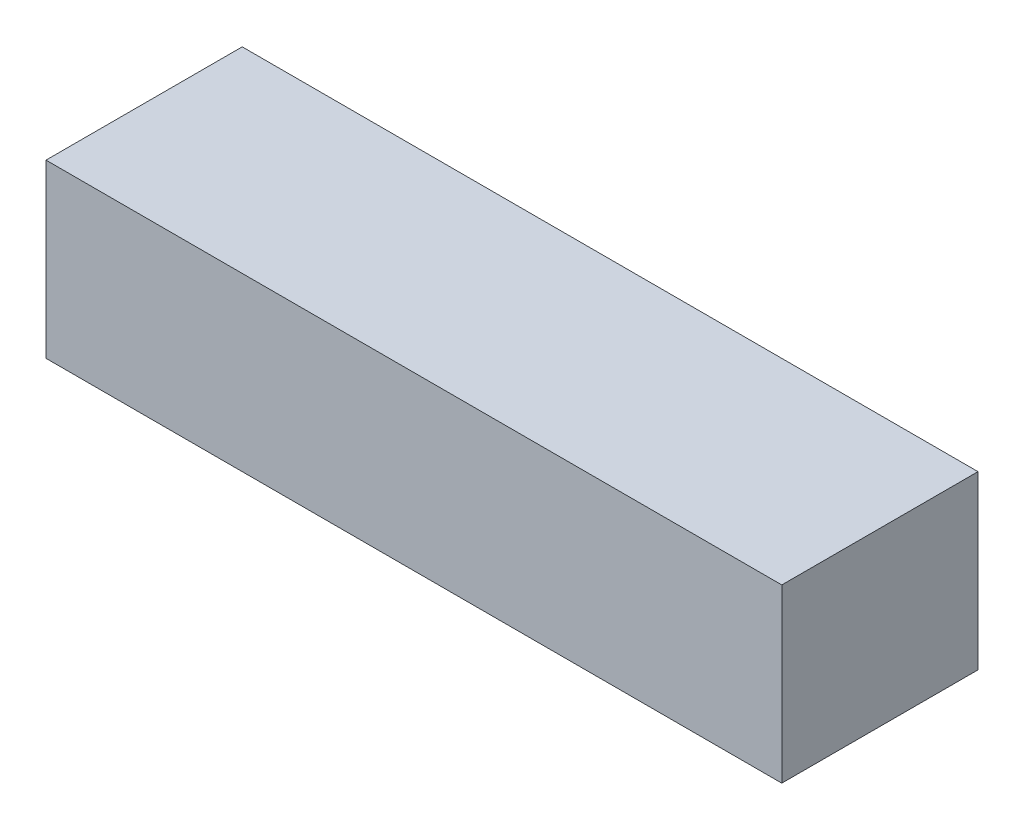
ISO-10303-21;
HEADER;
FILE_DESCRIPTION(('STEP AP214'),'2;1');
FILE_NAME('part.step','',(''),(''),'','','');
FILE_SCHEMA(('AUTOMOTIVE_DESIGN { 1 0 10303 214 1 1 1 1 }'));
ENDSEC;
DATA;
#1=APPLICATION_CONTEXT('core data for automotive mechanical design processes');
#2=APPLICATION_PROTOCOL_DEFINITION('international standard','automotive_design',2000,#1);
#3=PRODUCT_CONTEXT('',#1,'mechanical');
#4=PRODUCT('Part','Part','',(#3));
#5=PRODUCT_RELATED_PRODUCT_CATEGORY('part','',(#4));
#6=PRODUCT_DEFINITION_FORMATION('','',#4);
#7=PRODUCT_DEFINITION_CONTEXT('part definition',#1,'design');
#8=PRODUCT_DEFINITION('design','',#6,#7);
#9=PRODUCT_DEFINITION_SHAPE('','',#8);
#10=(LENGTH_UNIT() NAMED_UNIT(*) SI_UNIT(.MILLI.,.METRE.));
#11=(NAMED_UNIT(*) PLANE_ANGLE_UNIT() SI_UNIT($,.RADIAN.));
#12=(NAMED_UNIT(*) SI_UNIT($,.STERADIAN.) SOLID_ANGLE_UNIT());
#13=UNCERTAINTY_MEASURE_WITH_UNIT(LENGTH_MEASURE(1.E-05),#10,'distance_accuracy_value','');
#14=(GEOMETRIC_REPRESENTATION_CONTEXT(3) GLOBAL_UNCERTAINTY_ASSIGNED_CONTEXT((#13)) GLOBAL_UNIT_ASSIGNED_CONTEXT((#10,
#11,#12)) REPRESENTATION_CONTEXT('',''));
#15=CARTESIAN_POINT('',(0.,0.,0.));
#16=DIRECTION('',(0.,0.,1.));
#17=DIRECTION('',(1.,0.,0.));
#18=AXIS2_PLACEMENT_3D('',#15,#16,#17);
#19=CARTESIAN_POINT('',(75.,35.,-20.));
#20=DIRECTION('',(-1.,0.,0.));
#21=DIRECTION('',(0.,0.,1.));
#22=AXIS2_PLACEMENT_3D('',#19,#20,#21);
#23=PLANE('',#22);
#24=DIRECTION('',(0.,0.,-1.));
#25=VECTOR('',#24,1.);
#26=CARTESIAN_POINT('',(75.,0.,-20.));
#27=LINE('',#26,#25);
#28=CARTESIAN_POINT('',(75.,0.,20.));
#29=VERTEX_POINT('',#28);
#30=CARTESIAN_POINT('',(75.,0.,-20.));
#31=VERTEX_POINT('',#30);
#32=EDGE_CURVE('E113',#29,#31,#27,.T.);
#33=ORIENTED_EDGE('',*,*,#32,.T.);
#34=DIRECTION('',(0.,-1.,0.));
#35=VECTOR('',#34,1.);
#36=CARTESIAN_POINT('',(75.,35.,-20.));
#37=LINE('',#36,#35);
#38=CARTESIAN_POINT('',(75.,35.,-20.));
#39=VERTEX_POINT('',#38);
#40=EDGE_CURVE('E11',#39,#31,#37,.T.);
#41=ORIENTED_EDGE('',*,*,#40,.F.);
#42=DIRECTION('',(0.,0.,-1.));
#43=VECTOR('',#42,1.);
#44=CARTESIAN_POINT('',(75.,35.,-20.));
#45=LINE('',#44,#43);
#46=CARTESIAN_POINT('',(75.,35.,20.));
#47=VERTEX_POINT('',#46);
#48=EDGE_CURVE('E97',#47,#39,#45,.T.);
#49=ORIENTED_EDGE('',*,*,#48,.F.);
#50=DIRECTION('',(0.,-1.,0.));
#51=VECTOR('',#50,1.);
#52=CARTESIAN_POINT('',(75.,35.,20.));
#53=LINE('',#52,#51);
#54=EDGE_CURVE('E109',#47,#29,#53,.T.);
#55=ORIENTED_EDGE('',*,*,#54,.T.);
#56=EDGE_LOOP('',(#33,#41,#49,#55));
#57=FACE_BOUND('',#56,.T.);
#58=ADVANCED_FACE('F45',(#57),#23,.F.);
#59=CARTESIAN_POINT('',(-75.,35.,-20.));
#60=DIRECTION('',(0.,0.,1.));
#61=DIRECTION('',(1.,0.,0.));
#62=AXIS2_PLACEMENT_3D('',#59,#60,#61);
#63=PLANE('',#62);
#64=DIRECTION('',(-1.,0.,0.));
#65=VECTOR('',#64,1.);
#66=CARTESIAN_POINT('',(-75.,0.,-20.));
#67=LINE('',#66,#65);
#68=CARTESIAN_POINT('',(-75.,0.,-20.));
#69=VERTEX_POINT('',#68);
#70=EDGE_CURVE('E102',#31,#69,#67,.T.);
#71=ORIENTED_EDGE('',*,*,#70,.T.);
#72=DIRECTION('',(0.,-1.,0.));
#73=VECTOR('',#72,1.);
#74=CARTESIAN_POINT('',(-75.,35.,-20.));
#75=LINE('',#74,#73);
#76=CARTESIAN_POINT('',(-75.,35.,-20.));
#77=VERTEX_POINT('',#76);
#78=EDGE_CURVE('E54',#77,#69,#75,.T.);
#79=ORIENTED_EDGE('',*,*,#78,.F.);
#80=DIRECTION('',(-1.,0.,0.));
#81=VECTOR('',#80,1.);
#82=CARTESIAN_POINT('',(-75.,35.,-20.));
#83=LINE('',#82,#81);
#84=EDGE_CURVE('E92',#39,#77,#83,.T.);
#85=ORIENTED_EDGE('',*,*,#84,.F.);
#86=ORIENTED_EDGE('',*,*,#40,.T.);
#87=EDGE_LOOP('',(#71,#79,#85,#86));
#88=FACE_BOUND('',#87,.T.);
#89=ADVANCED_FACE('F101',(#88),#63,.F.);
#90=CARTESIAN_POINT('',(-75.,35.,-20.));
#91=DIRECTION('',(1.,0.,0.));
#92=DIRECTION('',(0.,0.,-1.));
#93=AXIS2_PLACEMENT_3D('',#90,#91,#92);
#94=PLANE('',#93);
#95=DIRECTION('',(0.,0.,1.));
#96=VECTOR('',#95,1.);
#97=CARTESIAN_POINT('',(-75.,0.,-20.));
#98=LINE('',#97,#96);
#99=CARTESIAN_POINT('',(-75.,0.,20.));
#100=VERTEX_POINT('',#99);
#101=EDGE_CURVE('E79',#69,#100,#98,.T.);
#102=ORIENTED_EDGE('',*,*,#101,.T.);
#103=DIRECTION('',(0.,-1.,0.));
#104=VECTOR('',#103,1.);
#105=CARTESIAN_POINT('',(-75.,35.,20.));
#106=LINE('',#105,#104);
#107=CARTESIAN_POINT('',(-75.,35.,20.));
#108=VERTEX_POINT('',#107);
#109=EDGE_CURVE('E104',#108,#100,#106,.T.);
#110=ORIENTED_EDGE('',*,*,#109,.F.);
#111=DIRECTION('',(0.,0.,1.));
#112=VECTOR('',#111,1.);
#113=CARTESIAN_POINT('',(-75.,35.,-20.));
#114=LINE('',#113,#112);
#115=EDGE_CURVE('E95',#77,#108,#114,.T.);
#116=ORIENTED_EDGE('',*,*,#115,.F.);
#117=ORIENTED_EDGE('',*,*,#78,.T.);
#118=EDGE_LOOP('',(#102,#110,#116,#117));
#119=FACE_BOUND('',#118,.T.);
#120=ADVANCED_FACE('F105',(#119),#94,.F.);
#121=CARTESIAN_POINT('',(-75.,35.,20.));
#122=DIRECTION('',(0.,0.,-1.));
#123=DIRECTION('',(-1.,0.,0.));
#124=AXIS2_PLACEMENT_3D('',#121,#122,#123);
#125=PLANE('',#124);
#126=DIRECTION('',(1.,0.,0.));
#127=VECTOR('',#126,1.);
#128=CARTESIAN_POINT('',(-75.,0.,20.));
#129=LINE('',#128,#127);
#130=EDGE_CURVE('E85',#100,#29,#129,.T.);
#131=ORIENTED_EDGE('',*,*,#130,.T.);
#132=ORIENTED_EDGE('',*,*,#54,.F.);
#133=DIRECTION('',(1.,0.,0.));
#134=VECTOR('',#133,1.);
#135=CARTESIAN_POINT('',(-75.,35.,20.));
#136=LINE('',#135,#134);
#137=EDGE_CURVE('E62',#108,#47,#136,.T.);
#138=ORIENTED_EDGE('',*,*,#137,.F.);
#139=ORIENTED_EDGE('',*,*,#109,.T.);
#140=EDGE_LOOP('',(#131,#132,#138,#139));
#141=FACE_BOUND('',#140,.T.);
#142=ADVANCED_FACE('F126',(#141),#125,.F.);
#143=CARTESIAN_POINT('',(0.,35.,0.));
#144=DIRECTION('',(0.,1.,0.));
#145=DIRECTION('',(0.,0.,1.));
#146=AXIS2_PLACEMENT_3D('',#143,#144,#145);
#147=PLANE('',#146);
#148=ORIENTED_EDGE('',*,*,#48,.T.);
#149=ORIENTED_EDGE('',*,*,#84,.T.);
#150=ORIENTED_EDGE('',*,*,#115,.T.);
#151=ORIENTED_EDGE('',*,*,#137,.T.);
#152=EDGE_LOOP('',(#148,#149,#150,#151));
#153=FACE_BOUND('',#152,.T.);
#154=ADVANCED_FACE('F93',(#153),#147,.T.);
#155=CARTESIAN_POINT('',(0.,0.,0.));
#156=DIRECTION('',(0.,1.,0.));
#157=DIRECTION('',(0.,0.,1.));
#158=AXIS2_PLACEMENT_3D('',#155,#156,#157);
#159=PLANE('',#158);
#160=ORIENTED_EDGE('',*,*,#32,.F.);
#161=ORIENTED_EDGE('',*,*,#130,.F.);
#162=ORIENTED_EDGE('',*,*,#101,.F.);
#163=ORIENTED_EDGE('',*,*,#70,.F.);
#164=EDGE_LOOP('',(#160,#161,#162,#163));
#165=FACE_BOUND('',#164,.T.);
#166=ADVANCED_FACE('F129',(#165),#159,.F.);
#167=CLOSED_SHELL('',(#58,#89,#120,#142,#154,#166));
#168=MANIFOLD_SOLID_BREP('B2',#167);
#169=ADVANCED_BREP_SHAPE_REPRESENTATION('',(#18,#168),#14);
#170=SHAPE_DEFINITION_REPRESENTATION(#9,#169);
ENDSEC;
END-ISO-10303-21;
